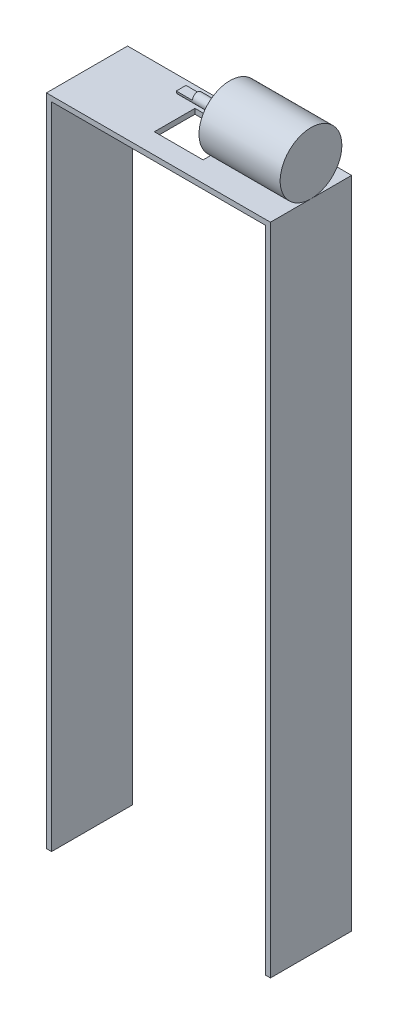
ISO-10303-21;
HEADER;
FILE_DESCRIPTION(('STEP AP214'),'2;1');
FILE_NAME('part.step','',(''),(''),'','','');
FILE_SCHEMA(('AUTOMOTIVE_DESIGN { 1 0 10303 214 1 1 1 1 }'));
ENDSEC;
DATA;
#1=APPLICATION_CONTEXT('core data for automotive mechanical design processes');
#2=APPLICATION_PROTOCOL_DEFINITION('international standard','automotive_design',2000,#1);
#3=PRODUCT_CONTEXT('',#1,'mechanical');
#4=PRODUCT('Part','Part','',(#3));
#5=PRODUCT_RELATED_PRODUCT_CATEGORY('part','',(#4));
#6=PRODUCT_DEFINITION_FORMATION('','',#4);
#7=PRODUCT_DEFINITION_CONTEXT('part definition',#1,'design');
#8=PRODUCT_DEFINITION('design','',#6,#7);
#9=PRODUCT_DEFINITION_SHAPE('','',#8);
#10=(LENGTH_UNIT() NAMED_UNIT(*) SI_UNIT(.MILLI.,.METRE.));
#11=(NAMED_UNIT(*) PLANE_ANGLE_UNIT() SI_UNIT($,.RADIAN.));
#12=(NAMED_UNIT(*) SI_UNIT($,.STERADIAN.) SOLID_ANGLE_UNIT());
#13=UNCERTAINTY_MEASURE_WITH_UNIT(LENGTH_MEASURE(1.E-05),#10,'distance_accuracy_value','');
#14=(GEOMETRIC_REPRESENTATION_CONTEXT(3) GLOBAL_UNCERTAINTY_ASSIGNED_CONTEXT((#13)) GLOBAL_UNIT_ASSIGNED_CONTEXT((#10,
#11,#12)) REPRESENTATION_CONTEXT('',''));
#15=CARTESIAN_POINT('',(0.,0.,0.));
#16=DIRECTION('',(0.,0.,1.));
#17=DIRECTION('',(1.,0.,0.));
#18=AXIS2_PLACEMENT_3D('',#15,#16,#17);
#19=CARTESIAN_POINT('',(88.0000000000005,422.175,-25.0000000000001));
#20=DIRECTION('',(1.,0.,0.));
#21=DIRECTION('',(0.,0.,-1.));
#22=AXIS2_PLACEMENT_3D('',#19,#20,#21);
#23=CYLINDRICAL_SURFACE('',#22,19.);
#24=CARTESIAN_POINT('',(88.0000000000005,422.175,-25.0000000000001));
#25=DIRECTION('',(1.,0.,0.));
#26=DIRECTION('',(0.,0.,-1.));
#27=AXIS2_PLACEMENT_3D('',#24,#25,#26);
#28=CIRCLE('',#27,19.);
#29=CARTESIAN_POINT('',(88.0000000000005,422.175,-44.0000000000001));
#30=VERTEX_POINT('',#29);
#31=EDGE_CURVE('E96',#30,#30,#28,.T.);
#32=ORIENTED_EDGE('',*,*,#31,.T.);
#33=EDGE_LOOP('',(#32));
#34=FACE_BOUND('',#33,.T.);
#35=CARTESIAN_POINT('',(138.,422.175,-25.0000000000001));
#36=DIRECTION('',(1.,0.,0.));
#37=DIRECTION('',(0.,0.,-1.));
#38=AXIS2_PLACEMENT_3D('',#35,#36,#37);
#39=CIRCLE('',#38,19.);
#40=CARTESIAN_POINT('',(138.,422.175,-44.0000000000001));
#41=VERTEX_POINT('',#40);
#42=EDGE_CURVE('E93',#41,#41,#39,.T.);
#43=ORIENTED_EDGE('',*,*,#42,.F.);
#44=EDGE_LOOP('',(#43));
#45=FACE_BOUND('',#44,.T.);
#46=ADVANCED_FACE('F55',(#34,#45),#23,.T.);
#47=CARTESIAN_POINT('',(88.0000000000005,422.175,-25.0000000000001));
#48=DIRECTION('',(1.,0.,0.));
#49=DIRECTION('',(0.,0.,-1.));
#50=AXIS2_PLACEMENT_3D('',#47,#48,#49);
#51=PLANE('',#50);
#52=CARTESIAN_POINT('',(88.0000000000005,422.175,-25.0000000000001));
#53=DIRECTION('',(-1.,0.,0.));
#54=DIRECTION('',(0.,0.,1.));
#55=AXIS2_PLACEMENT_3D('',#52,#53,#54);
#56=CIRCLE('',#55,3.);
#57=CARTESIAN_POINT('',(88.0000000000005,422.175,-22.0000000000001));
#58=VERTEX_POINT('',#57);
#59=EDGE_CURVE('E62',#58,#58,#56,.T.);
#60=ORIENTED_EDGE('',*,*,#59,.F.);
#61=EDGE_LOOP('',(#60));
#62=FACE_BOUND('',#61,.T.);
#63=ORIENTED_EDGE('',*,*,#31,.F.);
#64=EDGE_LOOP('',(#63));
#65=FACE_BOUND('',#64,.T.);
#66=ADVANCED_FACE('F106',(#62,#65),#51,.F.);
#67=CARTESIAN_POINT('',(138.,422.175,-25.0000000000001));
#68=DIRECTION('',(1.,0.,0.));
#69=DIRECTION('',(0.,0.,-1.));
#70=AXIS2_PLACEMENT_3D('',#67,#68,#69);
#71=PLANE('',#70);
#72=ORIENTED_EDGE('',*,*,#42,.T.);
#73=EDGE_LOOP('',(#72));
#74=FACE_BOUND('',#73,.T.);
#75=ADVANCED_FACE('F108',(#74),#71,.T.);
#76=CARTESIAN_POINT('',(58.0000000000005,422.175,-25.0000000000001));
#77=DIRECTION('',(1.,0.,0.));
#78=DIRECTION('',(0.,0.,-1.));
#79=AXIS2_PLACEMENT_3D('',#76,#77,#78);
#80=CYLINDRICAL_SURFACE('',#79,3.);
#81=CARTESIAN_POINT('',(58.0000000000005,422.175,-25.0000000000001));
#82=DIRECTION('',(-1.,0.,0.));
#83=DIRECTION('',(0.,0.,1.));
#84=AXIS2_PLACEMENT_3D('',#81,#82,#83);
#85=CIRCLE('',#84,3.);
#86=CARTESIAN_POINT('',(58.0000000000005,422.175,-28.0000000000001));
#87=VERTEX_POINT('',#86);
#88=CARTESIAN_POINT('',(58.0000000000005,422.175,-22.0000000000001));
#89=VERTEX_POINT('',#88);
#90=EDGE_CURVE('E90',#87,#89,#85,.T.);
#91=ORIENTED_EDGE('',*,*,#90,.F.);
#92=DIRECTION('',(-1.,0.,0.));
#93=VECTOR('',#92,1.);
#94=CARTESIAN_POINT('',(68.0000000000005,422.175,-28.));
#95=LINE('',#94,#93);
#96=CARTESIAN_POINT('',(68.0000000000005,422.175,-28.));
#97=VERTEX_POINT('',#96);
#98=EDGE_CURVE('E69',#97,#87,#95,.T.);
#99=ORIENTED_EDGE('',*,*,#98,.F.);
#100=CARTESIAN_POINT('',(68.0000000000005,422.175,-25.0000000000001));
#101=DIRECTION('',(1.,0.,0.));
#102=DIRECTION('',(0.,0.,-1.));
#103=AXIS2_PLACEMENT_3D('',#100,#101,#102);
#104=CIRCLE('',#103,3.);
#105=CARTESIAN_POINT('',(68.0000000000005,422.175,-22.0000000000001));
#106=VERTEX_POINT('',#105);
#107=EDGE_CURVE('E14',#97,#106,#104,.T.);
#108=ORIENTED_EDGE('',*,*,#107,.T.);
#109=DIRECTION('',(-1.,0.,0.));
#110=VECTOR('',#109,1.);
#111=CARTESIAN_POINT('',(68.0000000000005,422.175,-22.0000000000001));
#112=LINE('',#111,#110);
#113=EDGE_CURVE('E75',#106,#89,#112,.T.);
#114=ORIENTED_EDGE('',*,*,#113,.T.);
#115=EDGE_LOOP('',(#91,#99,#108,#114));
#116=FACE_BOUND('',#115,.T.);
#117=ORIENTED_EDGE('',*,*,#59,.T.);
#118=EDGE_LOOP('',(#117));
#119=FACE_BOUND('',#118,.T.);
#120=ADVANCED_FACE('F88',(#116,#119),#80,.T.);
#121=CARTESIAN_POINT('',(58.0000000000005,422.175,-25.0000000000001));
#122=DIRECTION('',(-1.,0.,0.));
#123=DIRECTION('',(0.,0.,1.));
#124=AXIS2_PLACEMENT_3D('',#121,#122,#123);
#125=PLANE('',#124);
#126=DIRECTION('',(0.,0.,1.));
#127=VECTOR('',#126,1.);
#128=CARTESIAN_POINT('',(58.0000000000005,422.175,-28.));
#129=LINE('',#128,#127);
#130=EDGE_CURVE('E80',#87,#89,#129,.T.);
#131=ORIENTED_EDGE('',*,*,#130,.F.);
#132=ORIENTED_EDGE('',*,*,#90,.T.);
#133=EDGE_LOOP('',(#131,#132));
#134=FACE_BOUND('',#133,.T.);
#135=ADVANCED_FACE('F92',(#134),#125,.T.);
#136=CARTESIAN_POINT('',(68.0000000000005,0.,0.));
#137=DIRECTION('',(1.,0.,0.));
#138=DIRECTION('',(0.,0.,-1.));
#139=AXIS2_PLACEMENT_3D('',#136,#137,#138);
#140=PLANE('',#139);
#141=DIRECTION('',(0.,0.,1.));
#142=VECTOR('',#141,1.);
#143=CARTESIAN_POINT('',(68.0000000000005,422.175,-28.));
#144=LINE('',#143,#142);
#145=EDGE_CURVE('E85',#97,#106,#144,.T.);
#146=ORIENTED_EDGE('',*,*,#145,.T.);
#147=ORIENTED_EDGE('',*,*,#107,.F.);
#148=EDGE_LOOP('',(#146,#147));
#149=FACE_BOUND('',#148,.T.);
#150=ADVANCED_FACE('F122',(#149),#140,.F.);
#151=CARTESIAN_POINT('',(68.0000000000005,422.175,-28.));
#152=DIRECTION('',(0.,-1.,0.));
#153=DIRECTION('',(0.,0.,-1.));
#154=AXIS2_PLACEMENT_3D('',#151,#152,#153);
#155=PLANE('',#154);
#156=ORIENTED_EDGE('',*,*,#130,.T.);
#157=ORIENTED_EDGE('',*,*,#113,.F.);
#158=ORIENTED_EDGE('',*,*,#145,.F.);
#159=ORIENTED_EDGE('',*,*,#98,.T.);
#160=EDGE_LOOP('',(#156,#157,#158,#159));
#161=FACE_BOUND('',#160,.T.);
#162=ADVANCED_FACE('F81',(#161),#155,.F.);
#163=CLOSED_SHELL('',(#46,#66,#75,#120,#135,#150,#162));
#164=MANIFOLD_SOLID_BREP('B2',#163);
#165=CARTESIAN_POINT('',(0.,400.,0.));
#166=DIRECTION('',(0.,1.,0.));
#167=DIRECTION('',(0.,0.,1.));
#168=AXIS2_PLACEMENT_3D('',#165,#166,#167);
#169=PLANE('',#168);
#170=DIRECTION('',(0.,0.,-1.));
#171=VECTOR('',#170,1.);
#172=CARTESIAN_POINT('',(54.0000000000002,400.,-12.5));
#173=LINE('',#172,#171);
#174=CARTESIAN_POINT('',(54.0000000000002,400.,-12.5));
#175=VERTEX_POINT('',#174);
#176=CARTESIAN_POINT('',(54.0000000000002,400.,-37.5));
#177=VERTEX_POINT('',#176);
#178=EDGE_CURVE('E280',#175,#177,#173,.T.);
#179=ORIENTED_EDGE('',*,*,#178,.F.);
#180=DIRECTION('',(-1.,0.,0.));
#181=VECTOR('',#180,1.);
#182=CARTESIAN_POINT('',(54.0000000000002,400.,-12.5));
#183=LINE('',#182,#181);
#184=CARTESIAN_POINT('',(84.0000000000002,400.,-12.5));
#185=VERTEX_POINT('',#184);
#186=EDGE_CURVE('E263',#185,#175,#183,.T.);
#187=ORIENTED_EDGE('',*,*,#186,.F.);
#188=DIRECTION('',(0.,0.,1.));
#189=VECTOR('',#188,1.);
#190=CARTESIAN_POINT('',(84.0000000000002,400.,-12.5));
#191=LINE('',#190,#189);
#192=CARTESIAN_POINT('',(84.0000000000002,400.,-37.5));
#193=VERTEX_POINT('',#192);
#194=EDGE_CURVE('E272',#193,#185,#191,.T.);
#195=ORIENTED_EDGE('',*,*,#194,.F.);
#196=DIRECTION('',(1.,0.,0.));
#197=VECTOR('',#196,1.);
#198=CARTESIAN_POINT('',(54.0000000000002,400.,-37.5));
#199=LINE('',#198,#197);
#200=EDGE_CURVE('E187',#177,#193,#199,.T.);
#201=ORIENTED_EDGE('',*,*,#200,.F.);
#202=EDGE_LOOP('',(#179,#187,#195,#201));
#203=FACE_BOUND('',#202,.T.);
#204=DIRECTION('',(0.,0.,1.));
#205=VECTOR('',#204,1.);
#206=CARTESIAN_POINT('',(134.825,400.,-50.));
#207=LINE('',#206,#205);
#208=CARTESIAN_POINT('',(134.825,400.,-50.));
#209=VERTEX_POINT('',#208);
#210=CARTESIAN_POINT('',(134.825,400.,0.));
#211=VERTEX_POINT('',#210);
#212=EDGE_CURVE('E297',#209,#211,#207,.T.);
#213=ORIENTED_EDGE('',*,*,#212,.T.);
#214=DIRECTION('',(1.,0.,0.));
#215=VECTOR('',#214,1.);
#216=CARTESIAN_POINT('',(0.,400.,0.));
#217=LINE('',#216,#215);
#218=CARTESIAN_POINT('',(3.17500000000026,400.,0.));
#219=VERTEX_POINT('',#218);
#220=EDGE_CURVE('E315',#219,#211,#217,.T.);
#221=ORIENTED_EDGE('',*,*,#220,.F.);
#222=DIRECTION('',(0.,0.,-1.));
#223=VECTOR('',#222,1.);
#224=CARTESIAN_POINT('',(3.17500000000026,400.,-50.0000000000002));
#225=LINE('',#224,#223);
#226=CARTESIAN_POINT('',(3.17500000000026,400.,-50.0000000000001));
#227=VERTEX_POINT('',#226);
#228=EDGE_CURVE('E335',#219,#227,#225,.T.);
#229=ORIENTED_EDGE('',*,*,#228,.T.);
#230=DIRECTION('',(-1.,0.,0.));
#231=VECTOR('',#230,1.);
#232=CARTESIAN_POINT('',(0.,400.,-50.0000000000001));
#233=LINE('',#232,#231);
#234=EDGE_CURVE('E320',#209,#227,#233,.T.);
#235=ORIENTED_EDGE('',*,*,#234,.F.);
#236=EDGE_LOOP('',(#213,#221,#229,#235));
#237=FACE_BOUND('',#236,.T.);
#238=ADVANCED_FACE('F172',(#203,#237),#169,.F.);
#239=CARTESIAN_POINT('',(3.17500000000026,400.,-50.0000000000002));
#240=DIRECTION('',(-1.,0.,0.));
#241=DIRECTION('',(0.,0.,1.));
#242=AXIS2_PLACEMENT_3D('',#239,#240,#241);
#243=PLANE('',#242);
#244=DIRECTION('',(0.,0.,-1.));
#245=VECTOR('',#244,1.);
#246=CARTESIAN_POINT('',(3.17500000000026,0.,-50.0000000000002));
#247=LINE('',#246,#245);
#248=CARTESIAN_POINT('',(3.17500000000026,0.,0.));
#249=VERTEX_POINT('',#248);
#250=CARTESIAN_POINT('',(3.17500000000026,0.,-50.0000000000002));
#251=VERTEX_POINT('',#250);
#252=EDGE_CURVE('E334',#249,#251,#247,.T.);
#253=ORIENTED_EDGE('',*,*,#252,.T.);
#254=DIRECTION('',(0.,-1.,0.));
#255=VECTOR('',#254,1.);
#256=CARTESIAN_POINT('',(3.17500000000026,400.,-50.0000000000002));
#257=LINE('',#256,#255);
#258=EDGE_CURVE('E53',#227,#251,#257,.T.);
#259=ORIENTED_EDGE('',*,*,#258,.F.);
#260=ORIENTED_EDGE('',*,*,#228,.F.);
#261=DIRECTION('',(0.,-1.,0.));
#262=VECTOR('',#261,1.);
#263=CARTESIAN_POINT('',(3.17500000000026,400.,0.));
#264=LINE('',#263,#262);
#265=EDGE_CURVE('E338',#219,#249,#264,.T.);
#266=ORIENTED_EDGE('',*,*,#265,.T.);
#267=EDGE_LOOP('',(#253,#259,#260,#266));
#268=FACE_BOUND('',#267,.T.);
#269=ADVANCED_FACE('F174',(#268),#243,.F.);
#270=CARTESIAN_POINT('',(3.17500000000026,400.,-50.0000000000002));
#271=DIRECTION('',(0.,0.,1.));
#272=DIRECTION('',(1.,0.,0.));
#273=AXIS2_PLACEMENT_3D('',#270,#271,#272);
#274=PLANE('',#273);
#275=DIRECTION('',(-1.,0.,0.));
#276=VECTOR('',#275,1.);
#277=CARTESIAN_POINT('',(3.17500000000026,0.,-50.0000000000002));
#278=LINE('',#277,#276);
#279=CARTESIAN_POINT('',(0.,0.,-50.0000000000001));
#280=VERTEX_POINT('',#279);
#281=EDGE_CURVE('E342',#251,#280,#278,.T.);
#282=ORIENTED_EDGE('',*,*,#281,.T.);
#283=DIRECTION('',(0.,-1.,0.));
#284=VECTOR('',#283,1.);
#285=CARTESIAN_POINT('',(0.,400.,-50.0000000000001));
#286=LINE('',#285,#284);
#287=CARTESIAN_POINT('',(0.,403.175,-50.0000000000001));
#288=VERTEX_POINT('',#287);
#289=EDGE_CURVE('E180',#288,#280,#286,.T.);
#290=ORIENTED_EDGE('',*,*,#289,.F.);
#291=DIRECTION('',(-1.,0.,0.));
#292=VECTOR('',#291,1.);
#293=CARTESIAN_POINT('',(0.,403.175,-50.0000000000001));
#294=LINE('',#293,#292);
#295=CARTESIAN_POINT('',(138.,403.175,-50.0000000000001));
#296=VERTEX_POINT('',#295);
#297=EDGE_CURVE('E324',#296,#288,#294,.T.);
#298=ORIENTED_EDGE('',*,*,#297,.F.);
#299=DIRECTION('',(0.,-1.,0.));
#300=VECTOR('',#299,1.);
#301=CARTESIAN_POINT('',(138.,403.175,-50.0000000000001));
#302=LINE('',#301,#300);
#303=CARTESIAN_POINT('',(138.,0.,-50.));
#304=VERTEX_POINT('',#303);
#305=EDGE_CURVE('E327',#296,#304,#302,.T.);
#306=ORIENTED_EDGE('',*,*,#305,.T.);
#307=DIRECTION('',(-1.,0.,0.));
#308=VECTOR('',#307,1.);
#309=CARTESIAN_POINT('',(138.,0.,-50.));
#310=LINE('',#309,#308);
#311=CARTESIAN_POINT('',(134.825,0.,-50.));
#312=VERTEX_POINT('',#311);
#313=EDGE_CURVE('E304',#304,#312,#310,.T.);
#314=ORIENTED_EDGE('',*,*,#313,.T.);
#315=DIRECTION('',(0.,-1.,0.));
#316=VECTOR('',#315,1.);
#317=CARTESIAN_POINT('',(134.825,400.,-50.));
#318=LINE('',#317,#316);
#319=EDGE_CURVE('E312',#209,#312,#318,.T.);
#320=ORIENTED_EDGE('',*,*,#319,.F.);
#321=ORIENTED_EDGE('',*,*,#234,.T.);
#322=ORIENTED_EDGE('',*,*,#258,.T.);
#323=EDGE_LOOP('',(#282,#290,#298,#306,#314,#320,#321,#322));
#324=FACE_BOUND('',#323,.T.);
#325=ADVANCED_FACE('F385',(#324),#274,.F.);
#326=CARTESIAN_POINT('',(0.,400.,-50.0000000000001));
#327=DIRECTION('',(1.,0.,0.));
#328=DIRECTION('',(0.,0.,-1.));
#329=AXIS2_PLACEMENT_3D('',#326,#327,#328);
#330=PLANE('',#329);
#331=DIRECTION('',(0.,0.,1.));
#332=VECTOR('',#331,1.);
#333=CARTESIAN_POINT('',(0.,0.,-50.0000000000001));
#334=LINE('',#333,#332);
#335=CARTESIAN_POINT('',(0.,0.,0.));
#336=VERTEX_POINT('',#335);
#337=EDGE_CURVE('E344',#280,#336,#334,.T.);
#338=ORIENTED_EDGE('',*,*,#337,.T.);
#339=DIRECTION('',(0.,-1.,0.));
#340=VECTOR('',#339,1.);
#341=CARTESIAN_POINT('',(0.,400.,0.));
#342=LINE('',#341,#340);
#343=CARTESIAN_POINT('',(0.,403.175,0.));
#344=VERTEX_POINT('',#343);
#345=EDGE_CURVE('E349',#344,#336,#342,.T.);
#346=ORIENTED_EDGE('',*,*,#345,.F.);
#347=DIRECTION('',(0.,0.,1.));
#348=VECTOR('',#347,1.);
#349=CARTESIAN_POINT('',(0.,403.175,-50.0000000000001));
#350=LINE('',#349,#348);
#351=EDGE_CURVE('E316',#288,#344,#350,.T.);
#352=ORIENTED_EDGE('',*,*,#351,.F.);
#353=ORIENTED_EDGE('',*,*,#289,.T.);
#354=EDGE_LOOP('',(#338,#346,#352,#353));
#355=FACE_BOUND('',#354,.T.);
#356=ADVANCED_FACE('F355',(#355),#330,.F.);
#357=CARTESIAN_POINT('',(3.17500000000026,400.,0.));
#358=DIRECTION('',(0.,0.,-1.));
#359=DIRECTION('',(-1.,0.,0.));
#360=AXIS2_PLACEMENT_3D('',#357,#358,#359);
#361=PLANE('',#360);
#362=DIRECTION('',(1.,0.,0.));
#363=VECTOR('',#362,1.);
#364=CARTESIAN_POINT('',(3.17500000000026,0.,0.));
#365=LINE('',#364,#363);
#366=EDGE_CURVE('E339',#336,#249,#365,.T.);
#367=ORIENTED_EDGE('',*,*,#366,.T.);
#368=ORIENTED_EDGE('',*,*,#265,.F.);
#369=ORIENTED_EDGE('',*,*,#220,.T.);
#370=DIRECTION('',(0.,-1.,0.));
#371=VECTOR('',#370,1.);
#372=CARTESIAN_POINT('',(134.825,400.,0.));
#373=LINE('',#372,#371);
#374=CARTESIAN_POINT('',(134.825,0.,0.));
#375=VERTEX_POINT('',#374);
#376=EDGE_CURVE('E300',#211,#375,#373,.T.);
#377=ORIENTED_EDGE('',*,*,#376,.T.);
#378=DIRECTION('',(1.,0.,0.));
#379=VECTOR('',#378,1.);
#380=CARTESIAN_POINT('',(138.,0.,0.));
#381=LINE('',#380,#379);
#382=CARTESIAN_POINT('',(138.,0.,0.));
#383=VERTEX_POINT('',#382);
#384=EDGE_CURVE('E301',#375,#383,#381,.T.);
#385=ORIENTED_EDGE('',*,*,#384,.T.);
#386=DIRECTION('',(0.,-1.,0.));
#387=VECTOR('',#386,1.);
#388=CARTESIAN_POINT('',(138.,403.175,0.));
#389=LINE('',#388,#387);
#390=CARTESIAN_POINT('',(138.,403.175,0.));
#391=VERTEX_POINT('',#390);
#392=EDGE_CURVE('E332',#391,#383,#389,.T.);
#393=ORIENTED_EDGE('',*,*,#392,.F.);
#394=DIRECTION('',(1.,0.,0.));
#395=VECTOR('',#394,1.);
#396=CARTESIAN_POINT('',(0.,403.175,0.));
#397=LINE('',#396,#395);
#398=EDGE_CURVE('E319',#344,#391,#397,.T.);
#399=ORIENTED_EDGE('',*,*,#398,.F.);
#400=ORIENTED_EDGE('',*,*,#345,.T.);
#401=EDGE_LOOP('',(#367,#368,#369,#377,#385,#393,#399,#400));
#402=FACE_BOUND('',#401,.T.);
#403=ADVANCED_FACE('F363',(#402),#361,.F.);
#404=CARTESIAN_POINT('',(0.,0.,0.));
#405=DIRECTION('',(0.,-1.,0.));
#406=DIRECTION('',(0.,0.,-1.));
#407=AXIS2_PLACEMENT_3D('',#404,#405,#406);
#408=PLANE('',#407);
#409=ORIENTED_EDGE('',*,*,#252,.F.);
#410=ORIENTED_EDGE('',*,*,#366,.F.);
#411=ORIENTED_EDGE('',*,*,#337,.F.);
#412=ORIENTED_EDGE('',*,*,#281,.F.);
#413=EDGE_LOOP('',(#409,#410,#411,#412));
#414=FACE_BOUND('',#413,.T.);
#415=ADVANCED_FACE('F361',(#414),#408,.T.);
#416=CARTESIAN_POINT('',(138.,403.175,-50.0000000000001));
#417=DIRECTION('',(-1.,0.,0.));
#418=DIRECTION('',(0.,0.,1.));
#419=AXIS2_PLACEMENT_3D('',#416,#417,#418);
#420=PLANE('',#419);
#421=ORIENTED_EDGE('',*,*,#392,.T.);
#422=DIRECTION('',(0.,0.,-1.));
#423=VECTOR('',#422,1.);
#424=CARTESIAN_POINT('',(138.,0.,-50.));
#425=LINE('',#424,#423);
#426=EDGE_CURVE('E275',#383,#304,#425,.T.);
#427=ORIENTED_EDGE('',*,*,#426,.T.);
#428=ORIENTED_EDGE('',*,*,#305,.F.);
#429=DIRECTION('',(0.,0.,-1.));
#430=VECTOR('',#429,1.);
#431=CARTESIAN_POINT('',(138.,403.175,-50.0000000000001));
#432=LINE('',#431,#430);
#433=EDGE_CURVE('E322',#391,#296,#432,.T.);
#434=ORIENTED_EDGE('',*,*,#433,.F.);
#435=EDGE_LOOP('',(#421,#427,#428,#434));
#436=FACE_BOUND('',#435,.T.);
#437=ADVANCED_FACE('F381',(#436),#420,.F.);
#438=CARTESIAN_POINT('',(0.,403.175,0.));
#439=DIRECTION('',(0.,1.,0.));
#440=DIRECTION('',(0.,0.,1.));
#441=AXIS2_PLACEMENT_3D('',#438,#439,#440);
#442=PLANE('',#441);
#443=DIRECTION('',(1.,0.,0.));
#444=VECTOR('',#443,1.);
#445=CARTESIAN_POINT('',(54.0000000000002,403.175,-12.5));
#446=LINE('',#445,#444);
#447=CARTESIAN_POINT('',(54.0000000000002,403.175,-12.5));
#448=VERTEX_POINT('',#447);
#449=CARTESIAN_POINT('',(84.0000000000002,403.175,-12.5));
#450=VERTEX_POINT('',#449);
#451=EDGE_CURVE('E195',#448,#450,#446,.T.);
#452=ORIENTED_EDGE('',*,*,#451,.F.);
#453=DIRECTION('',(0.,0.,1.));
#454=VECTOR('',#453,1.);
#455=CARTESIAN_POINT('',(54.0000000000002,403.175,-12.5));
#456=LINE('',#455,#454);
#457=CARTESIAN_POINT('',(54.0000000000002,403.175,-37.5));
#458=VERTEX_POINT('',#457);
#459=EDGE_CURVE('E269',#458,#448,#456,.T.);
#460=ORIENTED_EDGE('',*,*,#459,.F.);
#461=DIRECTION('',(-1.,0.,0.));
#462=VECTOR('',#461,1.);
#463=CARTESIAN_POINT('',(54.0000000000002,403.175,-37.5));
#464=LINE('',#463,#462);
#465=CARTESIAN_POINT('',(84.0000000000002,403.175,-37.5));
#466=VERTEX_POINT('',#465);
#467=EDGE_CURVE('E288',#466,#458,#464,.T.);
#468=ORIENTED_EDGE('',*,*,#467,.F.);
#469=DIRECTION('',(0.,0.,-1.));
#470=VECTOR('',#469,1.);
#471=CARTESIAN_POINT('',(84.0000000000002,403.175,-12.5));
#472=LINE('',#471,#470);
#473=EDGE_CURVE('E282',#450,#466,#472,.T.);
#474=ORIENTED_EDGE('',*,*,#473,.F.);
#475=EDGE_LOOP('',(#452,#460,#468,#474));
#476=FACE_BOUND('',#475,.T.);
#477=ORIENTED_EDGE('',*,*,#351,.T.);
#478=ORIENTED_EDGE('',*,*,#398,.T.);
#479=ORIENTED_EDGE('',*,*,#433,.T.);
#480=ORIENTED_EDGE('',*,*,#297,.T.);
#481=EDGE_LOOP('',(#477,#478,#479,#480));
#482=FACE_BOUND('',#481,.T.);
#483=ADVANCED_FACE('F384',(#476,#482),#442,.T.);
#484=CARTESIAN_POINT('',(134.825,400.,-50.));
#485=DIRECTION('',(1.,0.,0.));
#486=DIRECTION('',(0.,0.,-1.));
#487=AXIS2_PLACEMENT_3D('',#484,#485,#486);
#488=PLANE('',#487);
#489=DIRECTION('',(0.,0.,1.));
#490=VECTOR('',#489,1.);
#491=CARTESIAN_POINT('',(134.825,0.,-50.));
#492=LINE('',#491,#490);
#493=EDGE_CURVE('E306',#312,#375,#492,.T.);
#494=ORIENTED_EDGE('',*,*,#493,.T.);
#495=ORIENTED_EDGE('',*,*,#376,.F.);
#496=ORIENTED_EDGE('',*,*,#212,.F.);
#497=ORIENTED_EDGE('',*,*,#319,.T.);
#498=EDGE_LOOP('',(#494,#495,#496,#497));
#499=FACE_BOUND('',#498,.T.);
#500=ADVANCED_FACE('F386',(#499),#488,.F.);
#501=CARTESIAN_POINT('',(0.,0.,0.));
#502=DIRECTION('',(0.,-1.,0.));
#503=DIRECTION('',(0.,0.,-1.));
#504=AXIS2_PLACEMENT_3D('',#501,#502,#503);
#505=PLANE('',#504);
#506=ORIENTED_EDGE('',*,*,#426,.F.);
#507=ORIENTED_EDGE('',*,*,#384,.F.);
#508=ORIENTED_EDGE('',*,*,#493,.F.);
#509=ORIENTED_EDGE('',*,*,#313,.F.);
#510=EDGE_LOOP('',(#506,#507,#508,#509));
#511=FACE_BOUND('',#510,.T.);
#512=ADVANCED_FACE('F377',(#511),#505,.T.);
#513=CARTESIAN_POINT('',(54.0000000000002,-0.000999999999973245,-12.5));
#514=DIRECTION('',(0.,0.,1.));
#515=DIRECTION('',(1.,0.,0.));
#516=AXIS2_PLACEMENT_3D('',#513,#514,#515);
#517=PLANE('',#516);
#518=ORIENTED_EDGE('',*,*,#186,.T.);
#519=DIRECTION('',(0.,1.,0.));
#520=VECTOR('',#519,1.);
#521=CARTESIAN_POINT('',(54.0000000000002,-0.000999999999973245,-12.5));
#522=LINE('',#521,#520);
#523=EDGE_CURVE('E276',#175,#448,#522,.T.);
#524=ORIENTED_EDGE('',*,*,#523,.T.);
#525=ORIENTED_EDGE('',*,*,#451,.T.);
#526=DIRECTION('',(0.,1.,0.));
#527=VECTOR('',#526,1.);
#528=CARTESIAN_POINT('',(84.0000000000002,-0.000999999999973245,-12.5));
#529=LINE('',#528,#527);
#530=EDGE_CURVE('E259',#185,#450,#529,.T.);
#531=ORIENTED_EDGE('',*,*,#530,.F.);
#532=EDGE_LOOP('',(#518,#524,#525,#531));
#533=FACE_BOUND('',#532,.T.);
#534=ADVANCED_FACE('F261',(#533),#517,.F.);
#535=CARTESIAN_POINT('',(54.0000000000002,-0.000999999999973245,-12.5));
#536=DIRECTION('',(-1.,0.,0.));
#537=DIRECTION('',(0.,0.,1.));
#538=AXIS2_PLACEMENT_3D('',#535,#536,#537);
#539=PLANE('',#538);
#540=ORIENTED_EDGE('',*,*,#178,.T.);
#541=DIRECTION('',(0.,1.,0.));
#542=VECTOR('',#541,1.);
#543=CARTESIAN_POINT('',(54.0000000000002,-0.000999999999973245,-37.5));
#544=LINE('',#543,#542);
#545=EDGE_CURVE('E294',#177,#458,#544,.T.);
#546=ORIENTED_EDGE('',*,*,#545,.T.);
#547=ORIENTED_EDGE('',*,*,#459,.T.);
#548=ORIENTED_EDGE('',*,*,#523,.F.);
#549=EDGE_LOOP('',(#540,#546,#547,#548));
#550=FACE_BOUND('',#549,.T.);
#551=ADVANCED_FACE('F446',(#550),#539,.F.);
#552=CARTESIAN_POINT('',(54.0000000000002,-0.000999999999973245,-37.5));
#553=DIRECTION('',(0.,0.,-1.));
#554=DIRECTION('',(-1.,0.,0.));
#555=AXIS2_PLACEMENT_3D('',#552,#553,#554);
#556=PLANE('',#555);
#557=ORIENTED_EDGE('',*,*,#200,.T.);
#558=DIRECTION('',(0.,1.,0.));
#559=VECTOR('',#558,1.);
#560=CARTESIAN_POINT('',(84.0000000000002,-0.000999999999973245,-37.5));
#561=LINE('',#560,#559);
#562=EDGE_CURVE('E268',#193,#466,#561,.T.);
#563=ORIENTED_EDGE('',*,*,#562,.T.);
#564=ORIENTED_EDGE('',*,*,#467,.T.);
#565=ORIENTED_EDGE('',*,*,#545,.F.);
#566=EDGE_LOOP('',(#557,#563,#564,#565));
#567=FACE_BOUND('',#566,.T.);
#568=ADVANCED_FACE('F455',(#567),#556,.F.);
#569=CARTESIAN_POINT('',(84.0000000000002,-0.000999999999973245,-12.5));
#570=DIRECTION('',(1.,0.,0.));
#571=DIRECTION('',(0.,0.,-1.));
#572=AXIS2_PLACEMENT_3D('',#569,#570,#571);
#573=PLANE('',#572);
#574=ORIENTED_EDGE('',*,*,#194,.T.);
#575=ORIENTED_EDGE('',*,*,#530,.T.);
#576=ORIENTED_EDGE('',*,*,#473,.T.);
#577=ORIENTED_EDGE('',*,*,#562,.F.);
#578=EDGE_LOOP('',(#574,#575,#576,#577));
#579=FACE_BOUND('',#578,.T.);
#580=ADVANCED_FACE('F273',(#579),#573,.F.);
#581=CLOSED_SHELL('',(#238,#269,#325,#356,#403,#415,#437,#483,#500,#512,#534,#551,#568,#580));
#582=MANIFOLD_SOLID_BREP('B8',#581);
#583=ADVANCED_BREP_SHAPE_REPRESENTATION('',(#18,#164,#582),#14);
#584=SHAPE_DEFINITION_REPRESENTATION(#9,#583);
ENDSEC;
END-ISO-10303-21;
